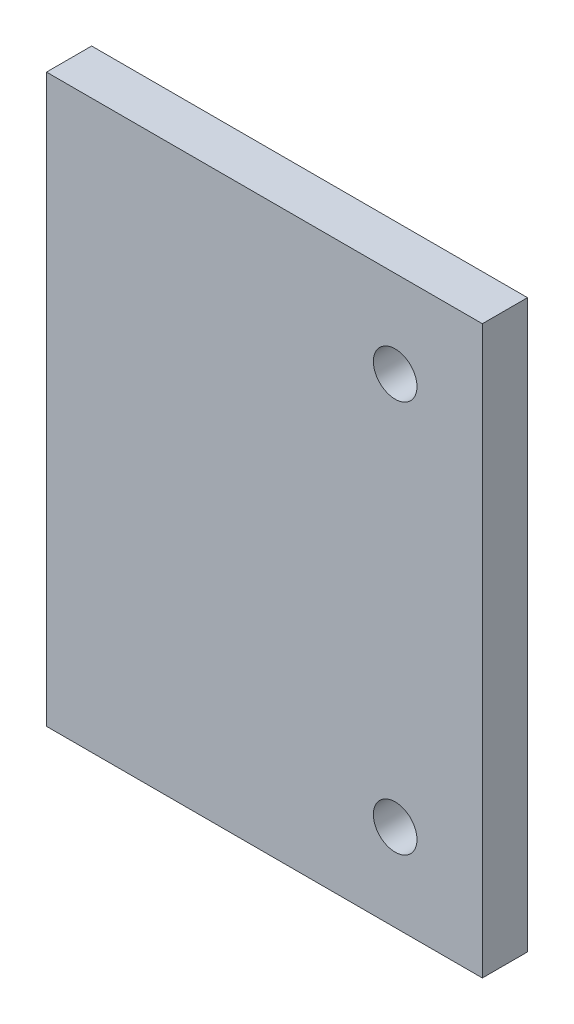
ISO-10303-21;
HEADER;
FILE_DESCRIPTION(('STEP AP214'),'2;1');
FILE_NAME('part.step','',(''),(''),'','','');
FILE_SCHEMA(('AUTOMOTIVE_DESIGN { 1 0 10303 214 1 1 1 1 }'));
ENDSEC;
DATA;
#1=APPLICATION_CONTEXT('core data for automotive mechanical design processes');
#2=APPLICATION_PROTOCOL_DEFINITION('international standard','automotive_design',2000,#1);
#3=PRODUCT_CONTEXT('',#1,'mechanical');
#4=PRODUCT('Part','Part','',(#3));
#5=PRODUCT_RELATED_PRODUCT_CATEGORY('part','',(#4));
#6=PRODUCT_DEFINITION_FORMATION('','',#4);
#7=PRODUCT_DEFINITION_CONTEXT('part definition',#1,'design');
#8=PRODUCT_DEFINITION('design','',#6,#7);
#9=PRODUCT_DEFINITION_SHAPE('','',#8);
#10=(LENGTH_UNIT() NAMED_UNIT(*) SI_UNIT(.MILLI.,.METRE.));
#11=(NAMED_UNIT(*) PLANE_ANGLE_UNIT() SI_UNIT($,.RADIAN.));
#12=(NAMED_UNIT(*) SI_UNIT($,.STERADIAN.) SOLID_ANGLE_UNIT());
#13=UNCERTAINTY_MEASURE_WITH_UNIT(LENGTH_MEASURE(1.E-05),#10,'distance_accuracy_value','');
#14=(GEOMETRIC_REPRESENTATION_CONTEXT(3) GLOBAL_UNCERTAINTY_ASSIGNED_CONTEXT((#13)) GLOBAL_UNIT_ASSIGNED_CONTEXT((#10,
#11,#12)) REPRESENTATION_CONTEXT('',''));
#15=CARTESIAN_POINT('',(0.,0.,0.));
#16=DIRECTION('',(0.,0.,1.));
#17=DIRECTION('',(1.,0.,0.));
#18=AXIS2_PLACEMENT_3D('',#15,#16,#17);
#19=CARTESIAN_POINT('',(31.75,-41.275,3.2893));
#20=DIRECTION('',(-1.,0.,0.));
#21=DIRECTION('',(0.,0.,1.));
#22=AXIS2_PLACEMENT_3D('',#19,#20,#21);
#23=PLANE('',#22);
#24=DIRECTION('',(0.,1.,0.));
#25=VECTOR('',#24,1.);
#26=CARTESIAN_POINT('',(31.75,-41.275,-3.2893));
#27=LINE('',#26,#25);
#28=CARTESIAN_POINT('',(31.75,-41.275,-3.2893));
#29=VERTEX_POINT('',#28);
#30=CARTESIAN_POINT('',(31.75,41.275,-3.2893));
#31=VERTEX_POINT('',#30);
#32=EDGE_CURVE('E104',#29,#31,#27,.T.);
#33=ORIENTED_EDGE('',*,*,#32,.T.);
#34=DIRECTION('',(0.,0.,-1.));
#35=VECTOR('',#34,1.);
#36=CARTESIAN_POINT('',(31.75,41.275,3.2893));
#37=LINE('',#36,#35);
#38=CARTESIAN_POINT('',(31.75,41.275,3.2893));
#39=VERTEX_POINT('',#38);
#40=EDGE_CURVE('E11',#39,#31,#37,.T.);
#41=ORIENTED_EDGE('',*,*,#40,.F.);
#42=DIRECTION('',(0.,1.,0.));
#43=VECTOR('',#42,1.);
#44=CARTESIAN_POINT('',(31.75,-41.275,3.2893));
#45=LINE('',#44,#43);
#46=CARTESIAN_POINT('',(31.75,-41.275,3.2893));
#47=VERTEX_POINT('',#46);
#48=EDGE_CURVE('E92',#47,#39,#45,.T.);
#49=ORIENTED_EDGE('',*,*,#48,.F.);
#50=DIRECTION('',(0.,0.,-1.));
#51=VECTOR('',#50,1.);
#52=CARTESIAN_POINT('',(31.75,-41.275,3.2893));
#53=LINE('',#52,#51);
#54=EDGE_CURVE('E100',#47,#29,#53,.T.);
#55=ORIENTED_EDGE('',*,*,#54,.T.);
#56=EDGE_LOOP('',(#33,#41,#49,#55));
#57=FACE_BOUND('',#56,.T.);
#58=ADVANCED_FACE('F40',(#57),#23,.F.);
#59=CARTESIAN_POINT('',(-31.75,41.275,3.2893));
#60=DIRECTION('',(0.,-1.,0.));
#61=DIRECTION('',(0.,0.,-1.));
#62=AXIS2_PLACEMENT_3D('',#59,#60,#61);
#63=PLANE('',#62);
#64=DIRECTION('',(-1.,0.,0.));
#65=VECTOR('',#64,1.);
#66=CARTESIAN_POINT('',(-31.75,41.275,-3.2893));
#67=LINE('',#66,#65);
#68=CARTESIAN_POINT('',(-31.75,41.275,-3.2893));
#69=VERTEX_POINT('',#68);
#70=EDGE_CURVE('E96',#31,#69,#67,.T.);
#71=ORIENTED_EDGE('',*,*,#70,.T.);
#72=DIRECTION('',(0.,0.,-1.));
#73=VECTOR('',#72,1.);
#74=CARTESIAN_POINT('',(-31.75,41.275,3.2893));
#75=LINE('',#74,#73);
#76=CARTESIAN_POINT('',(-31.75,41.275,3.2893));
#77=VERTEX_POINT('',#76);
#78=EDGE_CURVE('E48',#77,#69,#75,.T.);
#79=ORIENTED_EDGE('',*,*,#78,.F.);
#80=DIRECTION('',(-1.,0.,0.));
#81=VECTOR('',#80,1.);
#82=CARTESIAN_POINT('',(-31.75,41.275,3.2893));
#83=LINE('',#82,#81);
#84=EDGE_CURVE('E86',#39,#77,#83,.T.);
#85=ORIENTED_EDGE('',*,*,#84,.F.);
#86=ORIENTED_EDGE('',*,*,#40,.T.);
#87=EDGE_LOOP('',(#71,#79,#85,#86));
#88=FACE_BOUND('',#87,.T.);
#89=ADVANCED_FACE('F95',(#88),#63,.F.);
#90=CARTESIAN_POINT('',(-31.75,-41.275,3.2893));
#91=DIRECTION('',(1.,0.,0.));
#92=DIRECTION('',(0.,0.,-1.));
#93=AXIS2_PLACEMENT_3D('',#90,#91,#92);
#94=PLANE('',#93);
#95=DIRECTION('',(0.,-1.,0.));
#96=VECTOR('',#95,1.);
#97=CARTESIAN_POINT('',(-31.75,-41.275,-3.2893));
#98=LINE('',#97,#96);
#99=CARTESIAN_POINT('',(-31.75,-41.275,-3.2893));
#100=VERTEX_POINT('',#99);
#101=EDGE_CURVE('E73',#69,#100,#98,.T.);
#102=ORIENTED_EDGE('',*,*,#101,.T.);
#103=DIRECTION('',(0.,0.,-1.));
#104=VECTOR('',#103,1.);
#105=CARTESIAN_POINT('',(-31.75,-41.275,3.2893));
#106=LINE('',#105,#104);
#107=CARTESIAN_POINT('',(-31.75,-41.275,3.2893));
#108=VERTEX_POINT('',#107);
#109=EDGE_CURVE('E97',#108,#100,#106,.T.);
#110=ORIENTED_EDGE('',*,*,#109,.F.);
#111=DIRECTION('',(0.,-1.,0.));
#112=VECTOR('',#111,1.);
#113=CARTESIAN_POINT('',(-31.75,-41.275,3.2893));
#114=LINE('',#113,#112);
#115=EDGE_CURVE('E90',#77,#108,#114,.T.);
#116=ORIENTED_EDGE('',*,*,#115,.F.);
#117=ORIENTED_EDGE('',*,*,#78,.T.);
#118=EDGE_LOOP('',(#102,#110,#116,#117));
#119=FACE_BOUND('',#118,.T.);
#120=ADVANCED_FACE('F98',(#119),#94,.F.);
#121=CARTESIAN_POINT('',(-31.75,-41.275,3.2893));
#122=DIRECTION('',(0.,1.,0.));
#123=DIRECTION('',(0.,0.,1.));
#124=AXIS2_PLACEMENT_3D('',#121,#122,#123);
#125=PLANE('',#124);
#126=DIRECTION('',(1.,0.,0.));
#127=VECTOR('',#126,1.);
#128=CARTESIAN_POINT('',(-31.75,-41.275,-3.2893));
#129=LINE('',#128,#127);
#130=EDGE_CURVE('E79',#100,#29,#129,.T.);
#131=ORIENTED_EDGE('',*,*,#130,.T.);
#132=ORIENTED_EDGE('',*,*,#54,.F.);
#133=DIRECTION('',(1.,0.,0.));
#134=VECTOR('',#133,1.);
#135=CARTESIAN_POINT('',(-31.75,-41.275,3.2893));
#136=LINE('',#135,#134);
#137=EDGE_CURVE('E56',#108,#47,#136,.T.);
#138=ORIENTED_EDGE('',*,*,#137,.F.);
#139=ORIENTED_EDGE('',*,*,#109,.T.);
#140=EDGE_LOOP('',(#131,#132,#138,#139));
#141=FACE_BOUND('',#140,.T.);
#142=ADVANCED_FACE('F112',(#141),#125,.F.);
#143=CARTESIAN_POINT('',(0.,0.,3.2893));
#144=DIRECTION('',(0.,0.,-1.));
#145=DIRECTION('',(-1.,0.,0.));
#146=AXIS2_PLACEMENT_3D('',#143,#144,#145);
#147=PLANE('',#146);
#148=CARTESIAN_POINT('',(19.05,28.575,3.2893));
#149=DIRECTION('',(0.,0.,1.));
#150=DIRECTION('',(1.,0.,0.));
#151=AXIS2_PLACEMENT_3D('',#148,#149,#150);
#152=CIRCLE('',#151,3.175);
#153=CARTESIAN_POINT('',(22.225,28.575,3.2893));
#154=VERTEX_POINT('',#153);
#155=EDGE_CURVE('E126',#154,#154,#152,.T.);
#156=ORIENTED_EDGE('',*,*,#155,.F.);
#157=EDGE_LOOP('',(#156));
#158=FACE_BOUND('',#157,.T.);
#159=CARTESIAN_POINT('',(19.05,-28.575,3.2893));
#160=DIRECTION('',(0.,0.,1.));
#161=DIRECTION('',(1.,0.,0.));
#162=AXIS2_PLACEMENT_3D('',#159,#160,#161);
#163=CIRCLE('',#162,3.175);
#164=CARTESIAN_POINT('',(22.225,-28.575,3.2893));
#165=VERTEX_POINT('',#164);
#166=EDGE_CURVE('E120',#165,#165,#163,.T.);
#167=ORIENTED_EDGE('',*,*,#166,.F.);
#168=EDGE_LOOP('',(#167));
#169=FACE_BOUND('',#168,.T.);
#170=ORIENTED_EDGE('',*,*,#48,.T.);
#171=ORIENTED_EDGE('',*,*,#84,.T.);
#172=ORIENTED_EDGE('',*,*,#115,.T.);
#173=ORIENTED_EDGE('',*,*,#137,.T.);
#174=EDGE_LOOP('',(#170,#171,#172,#173));
#175=FACE_BOUND('',#174,.T.);
#176=ADVANCED_FACE('F88',(#158,#169,#175),#147,.F.);
#177=CARTESIAN_POINT('',(0.,0.,-3.2893));
#178=DIRECTION('',(0.,0.,-1.));
#179=DIRECTION('',(-1.,0.,0.));
#180=AXIS2_PLACEMENT_3D('',#177,#178,#179);
#181=PLANE('',#180);
#182=CARTESIAN_POINT('',(19.05,28.575,-3.2893));
#183=DIRECTION('',(0.,0.,1.));
#184=DIRECTION('',(1.,0.,0.));
#185=AXIS2_PLACEMENT_3D('',#182,#183,#184);
#186=CIRCLE('',#185,3.175);
#187=CARTESIAN_POINT('',(22.225,28.575,-3.2893));
#188=VERTEX_POINT('',#187);
#189=EDGE_CURVE('E123',#188,#188,#186,.T.);
#190=ORIENTED_EDGE('',*,*,#189,.T.);
#191=EDGE_LOOP('',(#190));
#192=FACE_BOUND('',#191,.T.);
#193=CARTESIAN_POINT('',(19.05,-28.575,-3.2893));
#194=DIRECTION('',(0.,0.,1.));
#195=DIRECTION('',(1.,0.,0.));
#196=AXIS2_PLACEMENT_3D('',#193,#194,#195);
#197=CIRCLE('',#196,3.175);
#198=CARTESIAN_POINT('',(22.225,-28.575,-3.2893));
#199=VERTEX_POINT('',#198);
#200=EDGE_CURVE('E107',#199,#199,#197,.T.);
#201=ORIENTED_EDGE('',*,*,#200,.T.);
#202=EDGE_LOOP('',(#201));
#203=FACE_BOUND('',#202,.T.);
#204=ORIENTED_EDGE('',*,*,#32,.F.);
#205=ORIENTED_EDGE('',*,*,#130,.F.);
#206=ORIENTED_EDGE('',*,*,#101,.F.);
#207=ORIENTED_EDGE('',*,*,#70,.F.);
#208=EDGE_LOOP('',(#204,#205,#206,#207));
#209=FACE_BOUND('',#208,.T.);
#210=ADVANCED_FACE('F115',(#192,#203,#209),#181,.T.);
#211=CARTESIAN_POINT('',(19.05,-28.575,3.2893));
#212=DIRECTION('',(0.,0.,1.));
#213=DIRECTION('',(1.,0.,0.));
#214=AXIS2_PLACEMENT_3D('',#211,#212,#213);
#215=CYLINDRICAL_SURFACE('',#214,3.175);
#216=ORIENTED_EDGE('',*,*,#200,.F.);
#217=EDGE_LOOP('',(#216));
#218=FACE_BOUND('',#217,.T.);
#219=ORIENTED_EDGE('',*,*,#166,.T.);
#220=EDGE_LOOP('',(#219));
#221=FACE_BOUND('',#220,.T.);
#222=ADVANCED_FACE('F137',(#218,#221),#215,.F.);
#223=CARTESIAN_POINT('',(19.05,28.575,3.2893));
#224=DIRECTION('',(0.,0.,1.));
#225=DIRECTION('',(1.,0.,0.));
#226=AXIS2_PLACEMENT_3D('',#223,#224,#225);
#227=CYLINDRICAL_SURFACE('',#226,3.175);
#228=ORIENTED_EDGE('',*,*,#189,.F.);
#229=EDGE_LOOP('',(#228));
#230=FACE_BOUND('',#229,.T.);
#231=ORIENTED_EDGE('',*,*,#155,.T.);
#232=EDGE_LOOP('',(#231));
#233=FACE_BOUND('',#232,.T.);
#234=ADVANCED_FACE('F130',(#230,#233),#227,.F.);
#235=CLOSED_SHELL('',(#58,#89,#120,#142,#176,#210,#222,#234));
#236=MANIFOLD_SOLID_BREP('B2',#235);
#237=ADVANCED_BREP_SHAPE_REPRESENTATION('',(#18,#236),#14);
#238=SHAPE_DEFINITION_REPRESENTATION(#9,#237);
ENDSEC;
END-ISO-10303-21;
